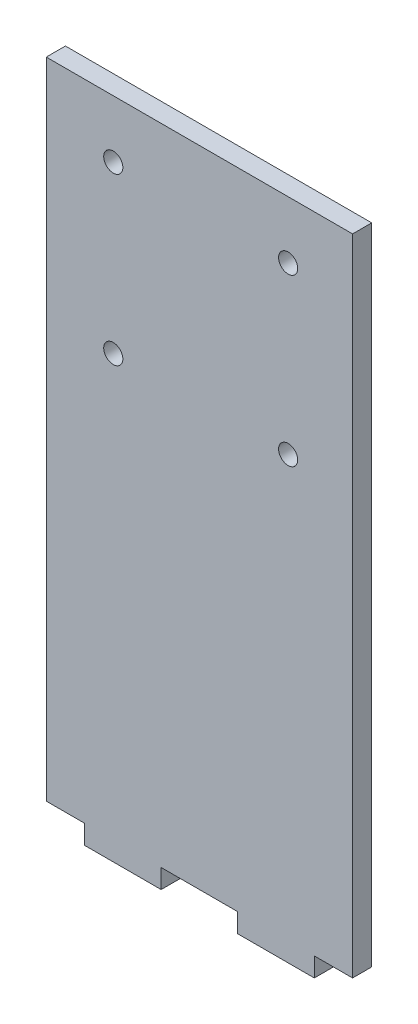
ISO-10303-21;
HEADER;
FILE_DESCRIPTION(('STEP AP214'),'2;1');
FILE_NAME('part.step','',(''),(''),'','','');
FILE_SCHEMA(('AUTOMOTIVE_DESIGN { 1 0 10303 214 1 1 1 1 }'));
ENDSEC;
DATA;
#1=APPLICATION_CONTEXT('core data for automotive mechanical design processes');
#2=APPLICATION_PROTOCOL_DEFINITION('international standard','automotive_design',2000,#1);
#3=PRODUCT_CONTEXT('',#1,'mechanical');
#4=PRODUCT('Part','Part','',(#3));
#5=PRODUCT_RELATED_PRODUCT_CATEGORY('part','',(#4));
#6=PRODUCT_DEFINITION_FORMATION('','',#4);
#7=PRODUCT_DEFINITION_CONTEXT('part definition',#1,'design');
#8=PRODUCT_DEFINITION('design','',#6,#7);
#9=PRODUCT_DEFINITION_SHAPE('','',#8);
#10=(LENGTH_UNIT() NAMED_UNIT(*) SI_UNIT(.MILLI.,.METRE.));
#11=(NAMED_UNIT(*) PLANE_ANGLE_UNIT() SI_UNIT($,.RADIAN.));
#12=(NAMED_UNIT(*) SI_UNIT($,.STERADIAN.) SOLID_ANGLE_UNIT());
#13=UNCERTAINTY_MEASURE_WITH_UNIT(LENGTH_MEASURE(1.E-05),#10,'distance_accuracy_value','');
#14=(GEOMETRIC_REPRESENTATION_CONTEXT(3) GLOBAL_UNCERTAINTY_ASSIGNED_CONTEXT((#13)) GLOBAL_UNIT_ASSIGNED_CONTEXT((#10,
#11,#12)) REPRESENTATION_CONTEXT('',''));
#15=CARTESIAN_POINT('',(0.,0.,0.));
#16=DIRECTION('',(0.,0.,1.));
#17=DIRECTION('',(1.,0.,0.));
#18=AXIS2_PLACEMENT_3D('',#15,#16,#17);
#19=CARTESIAN_POINT('',(50.8,0.,3.175));
#20=DIRECTION('',(-1.,0.,0.));
#21=DIRECTION('',(0.,-1.,0.));
#22=AXIS2_PLACEMENT_3D('',#19,#20,#21);
#23=PLANE('',#22);
#24=DIRECTION('',(0.,1.,0.));
#25=VECTOR('',#24,1.);
#26=CARTESIAN_POINT('',(50.8,0.,0.));
#27=LINE('',#26,#25);
#28=CARTESIAN_POINT('',(50.8,0.,0.));
#29=VERTEX_POINT('',#28);
#30=CARTESIAN_POINT('',(50.8,106.875,0.));
#31=VERTEX_POINT('',#30);
#32=EDGE_CURVE('E165',#29,#31,#27,.T.);
#33=ORIENTED_EDGE('',*,*,#32,.T.);
#34=DIRECTION('',(0.,0.,-1.));
#35=VECTOR('',#34,1.);
#36=CARTESIAN_POINT('',(50.8,106.875,3.175));
#37=LINE('',#36,#35);
#38=CARTESIAN_POINT('',(50.8,106.875,3.175));
#39=VERTEX_POINT('',#38);
#40=EDGE_CURVE('E11',#39,#31,#37,.T.);
#41=ORIENTED_EDGE('',*,*,#40,.F.);
#42=DIRECTION('',(0.,1.,0.));
#43=VECTOR('',#42,1.);
#44=CARTESIAN_POINT('',(50.8,0.,3.175));
#45=LINE('',#44,#43);
#46=CARTESIAN_POINT('',(50.8,0.,3.175));
#47=VERTEX_POINT('',#46);
#48=EDGE_CURVE('E100',#47,#39,#45,.T.);
#49=ORIENTED_EDGE('',*,*,#48,.F.);
#50=DIRECTION('',(0.,0.,-1.));
#51=VECTOR('',#50,1.);
#52=CARTESIAN_POINT('',(50.8,0.,3.175));
#53=LINE('',#52,#51);
#54=EDGE_CURVE('E149',#47,#29,#53,.T.);
#55=ORIENTED_EDGE('',*,*,#54,.T.);
#56=EDGE_LOOP('',(#33,#41,#49,#55));
#57=FACE_BOUND('',#56,.T.);
#58=ADVANCED_FACE('F35',(#57),#23,.F.);
#59=CARTESIAN_POINT('',(0.,106.875,3.175));
#60=DIRECTION('',(0.,1.,0.));
#61=DIRECTION('',(0.,0.,1.));
#62=AXIS2_PLACEMENT_3D('',#59,#60,#61);
#63=PLANE('',#62);
#64=DIRECTION('',(1.,0.,0.));
#65=VECTOR('',#64,1.);
#66=CARTESIAN_POINT('',(0.,106.875,0.));
#67=LINE('',#66,#65);
#68=CARTESIAN_POINT('',(0.,106.875,0.));
#69=VERTEX_POINT('',#68);
#70=EDGE_CURVE('E168',#69,#31,#67,.T.);
#71=ORIENTED_EDGE('',*,*,#70,.F.);
#72=DIRECTION('',(0.,0.,-1.));
#73=VECTOR('',#72,1.);
#74=CARTESIAN_POINT('',(0.,106.875,3.175));
#75=LINE('',#74,#73);
#76=CARTESIAN_POINT('',(0.,106.875,3.175));
#77=VERTEX_POINT('',#76);
#78=EDGE_CURVE('E44',#77,#69,#75,.T.);
#79=ORIENTED_EDGE('',*,*,#78,.F.);
#80=DIRECTION('',(1.,0.,0.));
#81=VECTOR('',#80,1.);
#82=CARTESIAN_POINT('',(0.,106.875,3.175));
#83=LINE('',#82,#81);
#84=EDGE_CURVE('E442',#77,#39,#83,.T.);
#85=ORIENTED_EDGE('',*,*,#84,.T.);
#86=ORIENTED_EDGE('',*,*,#40,.T.);
#87=EDGE_LOOP('',(#71,#79,#85,#86));
#88=FACE_BOUND('',#87,.T.);
#89=ADVANCED_FACE('F220',(#88),#63,.T.);
#90=CARTESIAN_POINT('',(0.,0.,3.175));
#91=DIRECTION('',(-1.,0.,0.));
#92=DIRECTION('',(0.,-1.,0.));
#93=AXIS2_PLACEMENT_3D('',#90,#91,#92);
#94=PLANE('',#93);
#95=DIRECTION('',(0.,1.,0.));
#96=VECTOR('',#95,1.);
#97=CARTESIAN_POINT('',(0.,0.,0.));
#98=LINE('',#97,#96);
#99=CARTESIAN_POINT('',(0.,0.,0.));
#100=VERTEX_POINT('',#99);
#101=EDGE_CURVE('E171',#100,#69,#98,.T.);
#102=ORIENTED_EDGE('',*,*,#101,.F.);
#103=DIRECTION('',(0.,0.,-1.));
#104=VECTOR('',#103,1.);
#105=CARTESIAN_POINT('',(0.,0.,3.175));
#106=LINE('',#105,#104);
#107=CARTESIAN_POINT('',(0.,0.,3.175));
#108=VERTEX_POINT('',#107);
#109=EDGE_CURVE('E210',#108,#100,#106,.T.);
#110=ORIENTED_EDGE('',*,*,#109,.F.);
#111=DIRECTION('',(0.,1.,0.));
#112=VECTOR('',#111,1.);
#113=CARTESIAN_POINT('',(0.,0.,3.175));
#114=LINE('',#113,#112);
#115=EDGE_CURVE('E217',#108,#77,#114,.T.);
#116=ORIENTED_EDGE('',*,*,#115,.T.);
#117=ORIENTED_EDGE('',*,*,#78,.T.);
#118=EDGE_LOOP('',(#102,#110,#116,#117));
#119=FACE_BOUND('',#118,.T.);
#120=ADVANCED_FACE('F215',(#119),#94,.T.);
#121=CARTESIAN_POINT('',(0.,0.,3.175));
#122=DIRECTION('',(0.,1.,0.));
#123=DIRECTION('',(-1.,0.,0.));
#124=AXIS2_PLACEMENT_3D('',#121,#122,#123);
#125=PLANE('',#124);
#126=DIRECTION('',(1.,0.,0.));
#127=VECTOR('',#126,1.);
#128=CARTESIAN_POINT('',(0.,0.,0.));
#129=LINE('',#128,#127);
#130=CARTESIAN_POINT('',(6.35000000000001,0.,0.));
#131=VERTEX_POINT('',#130);
#132=EDGE_CURVE('E174',#100,#131,#129,.T.);
#133=ORIENTED_EDGE('',*,*,#132,.T.);
#134=DIRECTION('',(0.,0.,-1.));
#135=VECTOR('',#134,1.);
#136=CARTESIAN_POINT('',(6.35000000000001,0.,3.175));
#137=LINE('',#136,#135);
#138=CARTESIAN_POINT('',(6.35000000000001,0.,3.175));
#139=VERTEX_POINT('',#138);
#140=EDGE_CURVE('E207',#139,#131,#137,.T.);
#141=ORIENTED_EDGE('',*,*,#140,.F.);
#142=DIRECTION('',(1.,0.,0.));
#143=VECTOR('',#142,1.);
#144=CARTESIAN_POINT('',(0.,0.,3.175));
#145=LINE('',#144,#143);
#146=EDGE_CURVE('E238',#108,#139,#145,.T.);
#147=ORIENTED_EDGE('',*,*,#146,.F.);
#148=ORIENTED_EDGE('',*,*,#109,.T.);
#149=EDGE_LOOP('',(#133,#141,#147,#148));
#150=FACE_BOUND('',#149,.T.);
#151=ADVANCED_FACE('F229',(#150),#125,.F.);
#152=CARTESIAN_POINT('',(6.35000000000001,0.,3.175));
#153=DIRECTION('',(1.,0.,0.));
#154=DIRECTION('',(0.,0.,-1.));
#155=AXIS2_PLACEMENT_3D('',#152,#153,#154);
#156=PLANE('',#155);
#157=DIRECTION('',(0.,-1.,0.));
#158=VECTOR('',#157,1.);
#159=CARTESIAN_POINT('',(6.35000000000001,0.,0.));
#160=LINE('',#159,#158);
#161=CARTESIAN_POINT('',(6.35000000000001,-3.175,0.));
#162=VERTEX_POINT('',#161);
#163=EDGE_CURVE('E176',#131,#162,#160,.T.);
#164=ORIENTED_EDGE('',*,*,#163,.T.);
#165=DIRECTION('',(0.,0.,-1.));
#166=VECTOR('',#165,1.);
#167=CARTESIAN_POINT('',(6.35000000000001,-3.175,3.175));
#168=LINE('',#167,#166);
#169=CARTESIAN_POINT('',(6.35000000000001,-3.175,3.175));
#170=VERTEX_POINT('',#169);
#171=EDGE_CURVE('E204',#170,#162,#168,.T.);
#172=ORIENTED_EDGE('',*,*,#171,.F.);
#173=DIRECTION('',(0.,-1.,0.));
#174=VECTOR('',#173,1.);
#175=CARTESIAN_POINT('',(6.35000000000001,0.,3.175));
#176=LINE('',#175,#174);
#177=EDGE_CURVE('E235',#139,#170,#176,.T.);
#178=ORIENTED_EDGE('',*,*,#177,.F.);
#179=ORIENTED_EDGE('',*,*,#140,.T.);
#180=EDGE_LOOP('',(#164,#172,#178,#179));
#181=FACE_BOUND('',#180,.T.);
#182=ADVANCED_FACE('F233',(#181),#156,.F.);
#183=CARTESIAN_POINT('',(0.,-3.175,3.175));
#184=DIRECTION('',(0.,1.,0.));
#185=DIRECTION('',(0.,0.,1.));
#186=AXIS2_PLACEMENT_3D('',#183,#184,#185);
#187=PLANE('',#186);
#188=DIRECTION('',(1.,0.,0.));
#189=VECTOR('',#188,1.);
#190=CARTESIAN_POINT('',(0.,-3.175,0.));
#191=LINE('',#190,#189);
#192=CARTESIAN_POINT('',(19.05,-3.175,0.));
#193=VERTEX_POINT('',#192);
#194=EDGE_CURVE('E178',#162,#193,#191,.T.);
#195=ORIENTED_EDGE('',*,*,#194,.T.);
#196=DIRECTION('',(0.,0.,-1.));
#197=VECTOR('',#196,1.);
#198=CARTESIAN_POINT('',(19.05,-3.175,3.175));
#199=LINE('',#198,#197);
#200=CARTESIAN_POINT('',(19.05,-3.175,3.175));
#201=VERTEX_POINT('',#200);
#202=EDGE_CURVE('E201',#201,#193,#199,.T.);
#203=ORIENTED_EDGE('',*,*,#202,.F.);
#204=DIRECTION('',(1.,0.,0.));
#205=VECTOR('',#204,1.);
#206=CARTESIAN_POINT('',(0.,-3.175,3.175));
#207=LINE('',#206,#205);
#208=EDGE_CURVE('E237',#170,#201,#207,.T.);
#209=ORIENTED_EDGE('',*,*,#208,.F.);
#210=ORIENTED_EDGE('',*,*,#171,.T.);
#211=EDGE_LOOP('',(#195,#203,#209,#210));
#212=FACE_BOUND('',#211,.T.);
#213=ADVANCED_FACE('F376',(#212),#187,.F.);
#214=CARTESIAN_POINT('',(19.05,0.,3.175));
#215=DIRECTION('',(-1.,0.,0.));
#216=DIRECTION('',(0.,0.,1.));
#217=AXIS2_PLACEMENT_3D('',#214,#215,#216);
#218=PLANE('',#217);
#219=DIRECTION('',(0.,1.,0.));
#220=VECTOR('',#219,1.);
#221=CARTESIAN_POINT('',(19.05,0.,0.));
#222=LINE('',#221,#220);
#223=CARTESIAN_POINT('',(19.05,0.,0.));
#224=VERTEX_POINT('',#223);
#225=EDGE_CURVE('E180',#193,#224,#222,.T.);
#226=ORIENTED_EDGE('',*,*,#225,.T.);
#227=DIRECTION('',(0.,0.,-1.));
#228=VECTOR('',#227,1.);
#229=CARTESIAN_POINT('',(19.05,0.,3.175));
#230=LINE('',#229,#228);
#231=CARTESIAN_POINT('',(19.05,0.,3.175));
#232=VERTEX_POINT('',#231);
#233=EDGE_CURVE('E198',#232,#224,#230,.T.);
#234=ORIENTED_EDGE('',*,*,#233,.F.);
#235=DIRECTION('',(0.,1.,0.));
#236=VECTOR('',#235,1.);
#237=CARTESIAN_POINT('',(19.05,0.,3.175));
#238=LINE('',#237,#236);
#239=EDGE_CURVE('E240',#201,#232,#238,.T.);
#240=ORIENTED_EDGE('',*,*,#239,.F.);
#241=ORIENTED_EDGE('',*,*,#202,.T.);
#242=EDGE_LOOP('',(#226,#234,#240,#241));
#243=FACE_BOUND('',#242,.T.);
#244=ADVANCED_FACE('F366',(#243),#218,.F.);
#245=CARTESIAN_POINT('',(0.,0.,3.175));
#246=DIRECTION('',(0.,1.,0.));
#247=DIRECTION('',(-1.,0.,0.));
#248=AXIS2_PLACEMENT_3D('',#245,#246,#247);
#249=PLANE('',#248);
#250=DIRECTION('',(1.,0.,0.));
#251=VECTOR('',#250,1.);
#252=CARTESIAN_POINT('',(0.,0.,0.));
#253=LINE('',#252,#251);
#254=CARTESIAN_POINT('',(31.75,0.,0.));
#255=VERTEX_POINT('',#254);
#256=EDGE_CURVE('E182',#224,#255,#253,.T.);
#257=ORIENTED_EDGE('',*,*,#256,.T.);
#258=DIRECTION('',(0.,0.,-1.));
#259=VECTOR('',#258,1.);
#260=CARTESIAN_POINT('',(31.75,0.,3.175));
#261=LINE('',#260,#259);
#262=CARTESIAN_POINT('',(31.75,0.,3.175));
#263=VERTEX_POINT('',#262);
#264=EDGE_CURVE('E196',#263,#255,#261,.T.);
#265=ORIENTED_EDGE('',*,*,#264,.F.);
#266=DIRECTION('',(1.,0.,0.));
#267=VECTOR('',#266,1.);
#268=CARTESIAN_POINT('',(0.,0.,3.175));
#269=LINE('',#268,#267);
#270=EDGE_CURVE('E246',#232,#263,#269,.T.);
#271=ORIENTED_EDGE('',*,*,#270,.F.);
#272=ORIENTED_EDGE('',*,*,#233,.T.);
#273=EDGE_LOOP('',(#257,#265,#271,#272));
#274=FACE_BOUND('',#273,.T.);
#275=ADVANCED_FACE('F357',(#274),#249,.F.);
#276=CARTESIAN_POINT('',(31.75,0.,3.175));
#277=DIRECTION('',(-1.,0.,0.));
#278=DIRECTION('',(0.,-1.,0.));
#279=AXIS2_PLACEMENT_3D('',#276,#277,#278);
#280=PLANE('',#279);
#281=DIRECTION('',(0.,1.,0.));
#282=VECTOR('',#281,1.);
#283=CARTESIAN_POINT('',(31.75,0.,0.));
#284=LINE('',#283,#282);
#285=CARTESIAN_POINT('',(31.75,-3.175,0.));
#286=VERTEX_POINT('',#285);
#287=EDGE_CURVE('E185',#286,#255,#284,.T.);
#288=ORIENTED_EDGE('',*,*,#287,.F.);
#289=DIRECTION('',(0.,0.,-1.));
#290=VECTOR('',#289,1.);
#291=CARTESIAN_POINT('',(31.75,-3.175,3.175));
#292=LINE('',#291,#290);
#293=CARTESIAN_POINT('',(31.75,-3.175,3.175));
#294=VERTEX_POINT('',#293);
#295=EDGE_CURVE('E139',#294,#286,#292,.T.);
#296=ORIENTED_EDGE('',*,*,#295,.F.);
#297=DIRECTION('',(0.,1.,0.));
#298=VECTOR('',#297,1.);
#299=CARTESIAN_POINT('',(31.75,0.,3.175));
#300=LINE('',#299,#298);
#301=EDGE_CURVE('E145',#294,#263,#300,.T.);
#302=ORIENTED_EDGE('',*,*,#301,.T.);
#303=ORIENTED_EDGE('',*,*,#264,.T.);
#304=EDGE_LOOP('',(#288,#296,#302,#303));
#305=FACE_BOUND('',#304,.T.);
#306=ADVANCED_FACE('F249',(#305),#280,.T.);
#307=CARTESIAN_POINT('',(0.,-3.17500000000001,3.175));
#308=DIRECTION('',(0.,-1.,0.));
#309=DIRECTION('',(1.,0.,0.));
#310=AXIS2_PLACEMENT_3D('',#307,#308,#309);
#311=PLANE('',#310);
#312=DIRECTION('',(-1.,0.,0.));
#313=VECTOR('',#312,1.);
#314=CARTESIAN_POINT('',(0.,-3.17500000000001,0.));
#315=LINE('',#314,#313);
#316=CARTESIAN_POINT('',(44.45,-3.17499999999999,0.));
#317=VERTEX_POINT('',#316);
#318=EDGE_CURVE('E134',#317,#286,#315,.T.);
#319=ORIENTED_EDGE('',*,*,#318,.F.);
#320=DIRECTION('',(0.,0.,-1.));
#321=VECTOR('',#320,1.);
#322=CARTESIAN_POINT('',(44.45,-3.17499999999999,3.175));
#323=LINE('',#322,#321);
#324=CARTESIAN_POINT('',(44.45,-3.17499999999999,3.175));
#325=VERTEX_POINT('',#324);
#326=EDGE_CURVE('E129',#325,#317,#323,.T.);
#327=ORIENTED_EDGE('',*,*,#326,.F.);
#328=DIRECTION('',(-1.,0.,0.));
#329=VECTOR('',#328,1.);
#330=CARTESIAN_POINT('',(0.,-3.17500000000001,3.175));
#331=LINE('',#330,#329);
#332=EDGE_CURVE('E132',#325,#294,#331,.T.);
#333=ORIENTED_EDGE('',*,*,#332,.T.);
#334=ORIENTED_EDGE('',*,*,#295,.T.);
#335=EDGE_LOOP('',(#319,#327,#333,#334));
#336=FACE_BOUND('',#335,.T.);
#337=ADVANCED_FACE('F131',(#336),#311,.T.);
#338=CARTESIAN_POINT('',(44.45,0.,3.175));
#339=DIRECTION('',(1.,0.,0.));
#340=DIRECTION('',(0.,0.,-1.));
#341=AXIS2_PLACEMENT_3D('',#338,#339,#340);
#342=PLANE('',#341);
#343=DIRECTION('',(0.,-1.,0.));
#344=VECTOR('',#343,1.);
#345=CARTESIAN_POINT('',(44.45,0.,0.));
#346=LINE('',#345,#344);
#347=CARTESIAN_POINT('',(44.45,0.,0.));
#348=VERTEX_POINT('',#347);
#349=EDGE_CURVE('E189',#348,#317,#346,.T.);
#350=ORIENTED_EDGE('',*,*,#349,.F.);
#351=DIRECTION('',(0.,0.,-1.));
#352=VECTOR('',#351,1.);
#353=CARTESIAN_POINT('',(44.45,0.,3.175));
#354=LINE('',#353,#352);
#355=CARTESIAN_POINT('',(44.45,0.,3.175));
#356=VERTEX_POINT('',#355);
#357=EDGE_CURVE('E91',#356,#348,#354,.T.);
#358=ORIENTED_EDGE('',*,*,#357,.F.);
#359=DIRECTION('',(0.,-1.,0.));
#360=VECTOR('',#359,1.);
#361=CARTESIAN_POINT('',(44.45,0.,3.175));
#362=LINE('',#361,#360);
#363=EDGE_CURVE('E143',#356,#325,#362,.T.);
#364=ORIENTED_EDGE('',*,*,#363,.T.);
#365=ORIENTED_EDGE('',*,*,#326,.T.);
#366=EDGE_LOOP('',(#350,#358,#364,#365));
#367=FACE_BOUND('',#366,.T.);
#368=ADVANCED_FACE('F147',(#367),#342,.T.);
#369=CARTESIAN_POINT('',(40.1125,97.35,3.175));
#370=DIRECTION('',(0.,0.,-1.));
#371=DIRECTION('',(-1.,0.,0.));
#372=AXIS2_PLACEMENT_3D('',#369,#370,#371);
#373=CYLINDRICAL_SURFACE('',#372,1.5875);
#374=CARTESIAN_POINT('',(40.1125,97.35,3.175));
#375=DIRECTION('',(0.,0.,1.));
#376=DIRECTION('',(1.,0.,0.));
#377=AXIS2_PLACEMENT_3D('',#374,#375,#376);
#378=CIRCLE('',#377,1.5875);
#379=CARTESIAN_POINT('',(41.7,97.35,3.175));
#380=VERTEX_POINT('',#379);
#381=EDGE_CURVE('E434',#380,#380,#378,.T.);
#382=ORIENTED_EDGE('',*,*,#381,.T.);
#383=EDGE_LOOP('',(#382));
#384=FACE_BOUND('',#383,.T.);
#385=CARTESIAN_POINT('',(40.1125,97.35,0.));
#386=DIRECTION('',(0.,0.,1.));
#387=DIRECTION('',(1.,0.,0.));
#388=AXIS2_PLACEMENT_3D('',#385,#386,#387);
#389=CIRCLE('',#388,1.5875);
#390=CARTESIAN_POINT('',(41.7,97.35,0.));
#391=VERTEX_POINT('',#390);
#392=EDGE_CURVE('E162',#391,#391,#389,.T.);
#393=ORIENTED_EDGE('',*,*,#392,.F.);
#394=EDGE_LOOP('',(#393));
#395=FACE_BOUND('',#394,.T.);
#396=ADVANCED_FACE('F274',(#384,#395),#373,.F.);
#397=CARTESIAN_POINT('',(40.1125,69.85,3.175));
#398=DIRECTION('',(0.,0.,-1.));
#399=DIRECTION('',(-1.,0.,0.));
#400=AXIS2_PLACEMENT_3D('',#397,#398,#399);
#401=CYLINDRICAL_SURFACE('',#400,1.5875);
#402=CARTESIAN_POINT('',(40.1125,69.85,3.175));
#403=DIRECTION('',(0.,0.,1.));
#404=DIRECTION('',(1.,0.,0.));
#405=AXIS2_PLACEMENT_3D('',#402,#403,#404);
#406=CIRCLE('',#405,1.5875);
#407=CARTESIAN_POINT('',(41.7,69.85,3.175));
#408=VERTEX_POINT('',#407);
#409=EDGE_CURVE('E431',#408,#408,#406,.T.);
#410=ORIENTED_EDGE('',*,*,#409,.T.);
#411=EDGE_LOOP('',(#410));
#412=FACE_BOUND('',#411,.T.);
#413=CARTESIAN_POINT('',(40.1125,69.85,0.));
#414=DIRECTION('',(0.,0.,1.));
#415=DIRECTION('',(1.,0.,0.));
#416=AXIS2_PLACEMENT_3D('',#413,#414,#415);
#417=CIRCLE('',#416,1.5875);
#418=CARTESIAN_POINT('',(41.7,69.85,0.));
#419=VERTEX_POINT('',#418);
#420=EDGE_CURVE('E159',#419,#419,#417,.T.);
#421=ORIENTED_EDGE('',*,*,#420,.F.);
#422=EDGE_LOOP('',(#421));
#423=FACE_BOUND('',#422,.T.);
#424=ADVANCED_FACE('F277',(#412,#423),#401,.F.);
#425=CARTESIAN_POINT('',(11.1125,97.35,3.175));
#426=DIRECTION('',(0.,0.,-1.));
#427=DIRECTION('',(-1.,0.,0.));
#428=AXIS2_PLACEMENT_3D('',#425,#426,#427);
#429=CYLINDRICAL_SURFACE('',#428,1.5875);
#430=CARTESIAN_POINT('',(11.1125,97.35,3.175));
#431=DIRECTION('',(0.,0.,1.));
#432=DIRECTION('',(1.,0.,0.));
#433=AXIS2_PLACEMENT_3D('',#430,#431,#432);
#434=CIRCLE('',#433,1.5875);
#435=CARTESIAN_POINT('',(12.7,97.35,3.175));
#436=VERTEX_POINT('',#435);
#437=EDGE_CURVE('E288',#436,#436,#434,.T.);
#438=ORIENTED_EDGE('',*,*,#437,.T.);
#439=EDGE_LOOP('',(#438));
#440=FACE_BOUND('',#439,.T.);
#441=CARTESIAN_POINT('',(11.1125,97.35,0.));
#442=DIRECTION('',(0.,0.,1.));
#443=DIRECTION('',(1.,0.,0.));
#444=AXIS2_PLACEMENT_3D('',#441,#442,#443);
#445=CIRCLE('',#444,1.5875);
#446=CARTESIAN_POINT('',(12.7,97.35,0.));
#447=VERTEX_POINT('',#446);
#448=EDGE_CURVE('E156',#447,#447,#445,.T.);
#449=ORIENTED_EDGE('',*,*,#448,.F.);
#450=EDGE_LOOP('',(#449));
#451=FACE_BOUND('',#450,.T.);
#452=ADVANCED_FACE('F262',(#440,#451),#429,.F.);
#453=CARTESIAN_POINT('',(11.1125,69.85,3.175));
#454=DIRECTION('',(0.,0.,-1.));
#455=DIRECTION('',(-1.,0.,0.));
#456=AXIS2_PLACEMENT_3D('',#453,#454,#455);
#457=CYLINDRICAL_SURFACE('',#456,1.5875);
#458=CARTESIAN_POINT('',(11.1125,69.85,3.175));
#459=DIRECTION('',(0.,0.,1.));
#460=DIRECTION('',(1.,0.,0.));
#461=AXIS2_PLACEMENT_3D('',#458,#459,#460);
#462=CIRCLE('',#461,1.5875);
#463=CARTESIAN_POINT('',(12.7,69.85,3.175));
#464=VERTEX_POINT('',#463);
#465=EDGE_CURVE('E192',#464,#464,#462,.T.);
#466=ORIENTED_EDGE('',*,*,#465,.T.);
#467=EDGE_LOOP('',(#466));
#468=FACE_BOUND('',#467,.T.);
#469=CARTESIAN_POINT('',(11.1125,69.85,0.));
#470=DIRECTION('',(0.,0.,1.));
#471=DIRECTION('',(1.,0.,0.));
#472=AXIS2_PLACEMENT_3D('',#469,#470,#471);
#473=CIRCLE('',#472,1.5875);
#474=CARTESIAN_POINT('',(12.7,69.85,0.));
#475=VERTEX_POINT('',#474);
#476=EDGE_CURVE('E153',#475,#475,#473,.T.);
#477=ORIENTED_EDGE('',*,*,#476,.F.);
#478=EDGE_LOOP('',(#477));
#479=FACE_BOUND('',#478,.T.);
#480=ADVANCED_FACE('F37',(#468,#479),#457,.F.);
#481=CARTESIAN_POINT('',(0.,0.,3.175));
#482=DIRECTION('',(0.,1.,0.));
#483=DIRECTION('',(-1.,0.,0.));
#484=AXIS2_PLACEMENT_3D('',#481,#482,#483);
#485=PLANE('',#484);
#486=DIRECTION('',(1.,0.,0.));
#487=VECTOR('',#486,1.);
#488=CARTESIAN_POINT('',(0.,0.,0.));
#489=LINE('',#488,#487);
#490=EDGE_CURVE('E94',#348,#29,#489,.T.);
#491=ORIENTED_EDGE('',*,*,#490,.T.);
#492=ORIENTED_EDGE('',*,*,#54,.F.);
#493=DIRECTION('',(1.,0.,0.));
#494=VECTOR('',#493,1.);
#495=CARTESIAN_POINT('',(0.,0.,3.175));
#496=LINE('',#495,#494);
#497=EDGE_CURVE('E52',#356,#47,#496,.T.);
#498=ORIENTED_EDGE('',*,*,#497,.F.);
#499=ORIENTED_EDGE('',*,*,#357,.T.);
#500=EDGE_LOOP('',(#491,#492,#498,#499));
#501=FACE_BOUND('',#500,.T.);
#502=ADVANCED_FACE('F253',(#501),#485,.F.);
#503=CARTESIAN_POINT('',(0.,0.,3.175));
#504=DIRECTION('',(0.,0.,1.));
#505=DIRECTION('',(1.,0.,0.));
#506=AXIS2_PLACEMENT_3D('',#503,#504,#505);
#507=PLANE('',#506);
#508=ORIENTED_EDGE('',*,*,#465,.F.);
#509=EDGE_LOOP('',(#508));
#510=FACE_BOUND('',#509,.T.);
#511=ORIENTED_EDGE('',*,*,#437,.F.);
#512=EDGE_LOOP('',(#511));
#513=FACE_BOUND('',#512,.T.);
#514=ORIENTED_EDGE('',*,*,#409,.F.);
#515=EDGE_LOOP('',(#514));
#516=FACE_BOUND('',#515,.T.);
#517=ORIENTED_EDGE('',*,*,#381,.F.);
#518=EDGE_LOOP('',(#517));
#519=FACE_BOUND('',#518,.T.);
#520=ORIENTED_EDGE('',*,*,#48,.T.);
#521=ORIENTED_EDGE('',*,*,#84,.F.);
#522=ORIENTED_EDGE('',*,*,#115,.F.);
#523=ORIENTED_EDGE('',*,*,#146,.T.);
#524=ORIENTED_EDGE('',*,*,#177,.T.);
#525=ORIENTED_EDGE('',*,*,#208,.T.);
#526=ORIENTED_EDGE('',*,*,#239,.T.);
#527=ORIENTED_EDGE('',*,*,#270,.T.);
#528=ORIENTED_EDGE('',*,*,#301,.F.);
#529=ORIENTED_EDGE('',*,*,#332,.F.);
#530=ORIENTED_EDGE('',*,*,#363,.F.);
#531=ORIENTED_EDGE('',*,*,#497,.T.);
#532=EDGE_LOOP('',(#520,#521,#522,#523,#524,#525,#526,#527,#528,#529,#530,#531));
#533=FACE_BOUND('',#532,.T.);
#534=ADVANCED_FACE('F142',(#510,#513,#516,#519,#533),#507,.T.);
#535=CARTESIAN_POINT('',(0.,0.,0.));
#536=DIRECTION('',(0.,0.,1.));
#537=DIRECTION('',(1.,0.,0.));
#538=AXIS2_PLACEMENT_3D('',#535,#536,#537);
#539=PLANE('',#538);
#540=ORIENTED_EDGE('',*,*,#476,.T.);
#541=EDGE_LOOP('',(#540));
#542=FACE_BOUND('',#541,.T.);
#543=ORIENTED_EDGE('',*,*,#448,.T.);
#544=EDGE_LOOP('',(#543));
#545=FACE_BOUND('',#544,.T.);
#546=ORIENTED_EDGE('',*,*,#420,.T.);
#547=EDGE_LOOP('',(#546));
#548=FACE_BOUND('',#547,.T.);
#549=ORIENTED_EDGE('',*,*,#392,.T.);
#550=EDGE_LOOP('',(#549));
#551=FACE_BOUND('',#550,.T.);
#552=ORIENTED_EDGE('',*,*,#32,.F.);
#553=ORIENTED_EDGE('',*,*,#490,.F.);
#554=ORIENTED_EDGE('',*,*,#349,.T.);
#555=ORIENTED_EDGE('',*,*,#318,.T.);
#556=ORIENTED_EDGE('',*,*,#287,.T.);
#557=ORIENTED_EDGE('',*,*,#256,.F.);
#558=ORIENTED_EDGE('',*,*,#225,.F.);
#559=ORIENTED_EDGE('',*,*,#194,.F.);
#560=ORIENTED_EDGE('',*,*,#163,.F.);
#561=ORIENTED_EDGE('',*,*,#132,.F.);
#562=ORIENTED_EDGE('',*,*,#101,.T.);
#563=ORIENTED_EDGE('',*,*,#70,.T.);
#564=EDGE_LOOP('',(#552,#553,#554,#555,#556,#557,#558,#559,#560,#561,#562,#563));
#565=FACE_BOUND('',#564,.T.);
#566=ADVANCED_FACE('F224',(#542,#545,#548,#551,#565),#539,.F.);
#567=CLOSED_SHELL('',(#58,#89,#120,#151,#182,#213,#244,#275,#306,#337,#368,#396,#424,#452,#480,
#502,#534,#566));
#568=MANIFOLD_SOLID_BREP('B2',#567);
#569=ADVANCED_BREP_SHAPE_REPRESENTATION('',(#18,#568),#14);
#570=SHAPE_DEFINITION_REPRESENTATION(#9,#569);
ENDSEC;
END-ISO-10303-21;
